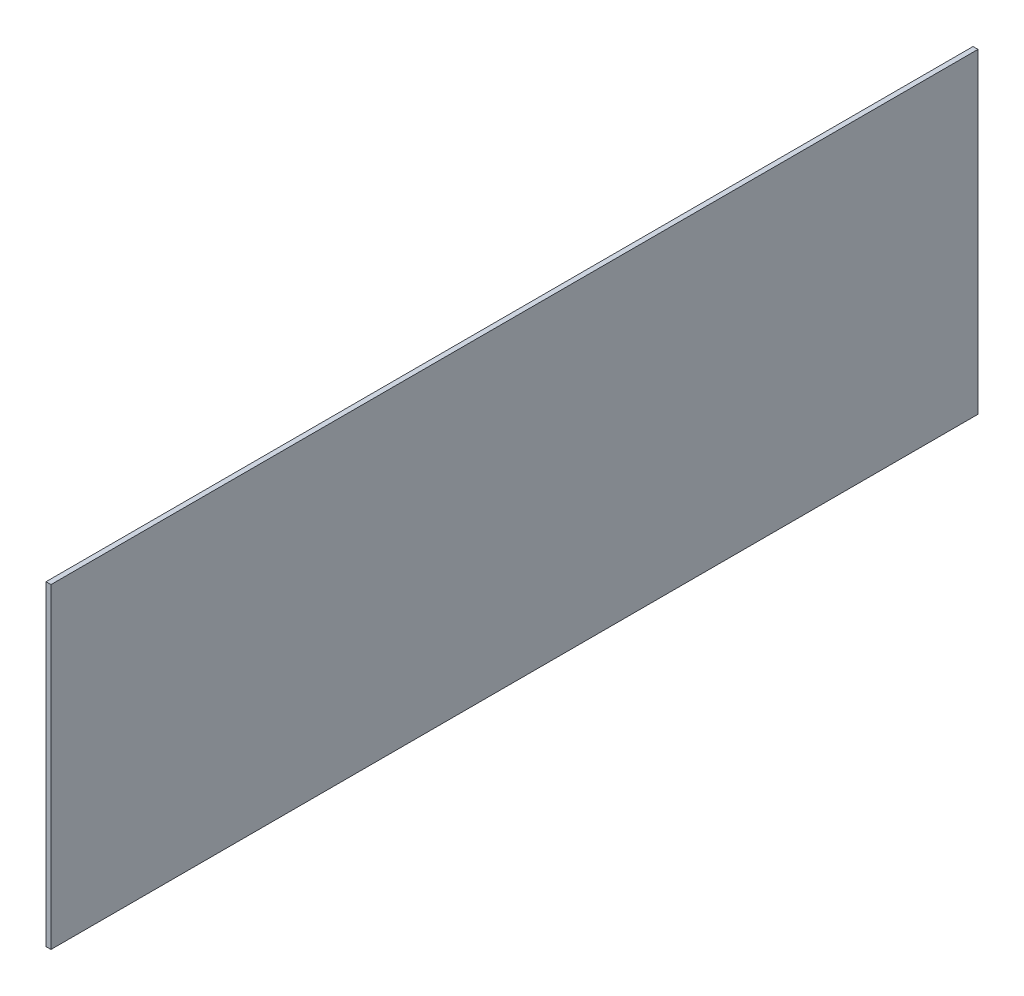
ISO-10303-21;
HEADER;
FILE_DESCRIPTION(('STEP AP214'),'2;1');
FILE_NAME('part.step','',(''),(''),'','','');
FILE_SCHEMA(('AUTOMOTIVE_DESIGN { 1 0 10303 214 1 1 1 1 }'));
ENDSEC;
DATA;
#1=APPLICATION_CONTEXT('core data for automotive mechanical design processes');
#2=APPLICATION_PROTOCOL_DEFINITION('international standard','automotive_design',2000,#1);
#3=PRODUCT_CONTEXT('',#1,'mechanical');
#4=PRODUCT('Part','Part','',(#3));
#5=PRODUCT_RELATED_PRODUCT_CATEGORY('part','',(#4));
#6=PRODUCT_DEFINITION_FORMATION('','',#4);
#7=PRODUCT_DEFINITION_CONTEXT('part definition',#1,'design');
#8=PRODUCT_DEFINITION('design','',#6,#7);
#9=PRODUCT_DEFINITION_SHAPE('','',#8);
#10=(LENGTH_UNIT() NAMED_UNIT(*) SI_UNIT(.MILLI.,.METRE.));
#11=(NAMED_UNIT(*) PLANE_ANGLE_UNIT() SI_UNIT($,.RADIAN.));
#12=(NAMED_UNIT(*) SI_UNIT($,.STERADIAN.) SOLID_ANGLE_UNIT());
#13=UNCERTAINTY_MEASURE_WITH_UNIT(LENGTH_MEASURE(1.E-05),#10,'distance_accuracy_value','');
#14=(GEOMETRIC_REPRESENTATION_CONTEXT(3) GLOBAL_UNCERTAINTY_ASSIGNED_CONTEXT((#13)) GLOBAL_UNIT_ASSIGNED_CONTEXT((#10,
#11,#12)) REPRESENTATION_CONTEXT('',''));
#15=CARTESIAN_POINT('',(0.,0.,0.));
#16=DIRECTION('',(0.,0.,1.));
#17=DIRECTION('',(1.,0.,0.));
#18=AXIS2_PLACEMENT_3D('',#15,#16,#17);
#19=CARTESIAN_POINT('',(-5.,0.,-935.));
#20=DIRECTION('',(0.,1.,0.));
#21=DIRECTION('',(1.,0.,0.));
#22=AXIS2_PLACEMENT_3D('',#19,#20,#21);
#23=PLANE('',#22);
#24=DIRECTION('',(-1.,0.,0.));
#25=VECTOR('',#24,1.);
#26=CARTESIAN_POINT('',(0.,0.,-1870.));
#27=LINE('',#26,#25);
#28=CARTESIAN_POINT('',(0.,0.,-1870.));
#29=VERTEX_POINT('',#28);
#30=CARTESIAN_POINT('',(-10.,0.,-1870.));
#31=VERTEX_POINT('',#30);
#32=EDGE_CURVE('E27',#29,#31,#27,.T.);
#33=ORIENTED_EDGE('',*,*,#32,.F.);
#34=DIRECTION('',(0.,0.,-1.));
#35=VECTOR('',#34,1.);
#36=CARTESIAN_POINT('',(0.,0.,0.));
#37=LINE('',#36,#35);
#38=CARTESIAN_POINT('',(0.,0.,0.));
#39=VERTEX_POINT('',#38);
#40=EDGE_CURVE('E72',#39,#29,#37,.T.);
#41=ORIENTED_EDGE('',*,*,#40,.F.);
#42=DIRECTION('',(1.,0.,0.));
#43=VECTOR('',#42,1.);
#44=CARTESIAN_POINT('',(-10.,0.,0.));
#45=LINE('',#44,#43);
#46=CARTESIAN_POINT('',(-10.,0.,0.));
#47=VERTEX_POINT('',#46);
#48=EDGE_CURVE('E97',#47,#39,#45,.T.);
#49=ORIENTED_EDGE('',*,*,#48,.F.);
#50=DIRECTION('',(0.,0.,1.));
#51=VECTOR('',#50,1.);
#52=CARTESIAN_POINT('',(-10.,0.,-1870.));
#53=LINE('',#52,#51);
#54=EDGE_CURVE('E73',#31,#47,#53,.T.);
#55=ORIENTED_EDGE('',*,*,#54,.F.);
#56=EDGE_LOOP('',(#33,#41,#49,#55));
#57=FACE_BOUND('',#56,.T.);
#58=ADVANCED_FACE('F17',(#57),#23,.F.);
#59=CARTESIAN_POINT('',(-5.,637.5,-935.));
#60=DIRECTION('',(0.,1.,0.));
#61=DIRECTION('',(1.,0.,0.));
#62=AXIS2_PLACEMENT_3D('',#59,#60,#61);
#63=PLANE('',#62);
#64=DIRECTION('',(-1.,0.,0.));
#65=VECTOR('',#64,1.);
#66=CARTESIAN_POINT('',(0.,637.5,-1870.));
#67=LINE('',#66,#65);
#68=CARTESIAN_POINT('',(0.,637.5,-1870.));
#69=VERTEX_POINT('',#68);
#70=CARTESIAN_POINT('',(-10.,637.5,-1870.));
#71=VERTEX_POINT('',#70);
#72=EDGE_CURVE('E11',#69,#71,#67,.T.);
#73=ORIENTED_EDGE('',*,*,#72,.T.);
#74=DIRECTION('',(0.,0.,1.));
#75=VECTOR('',#74,1.);
#76=CARTESIAN_POINT('',(-10.,637.5,-1870.));
#77=LINE('',#76,#75);
#78=CARTESIAN_POINT('',(-10.,637.5,0.));
#79=VERTEX_POINT('',#78);
#80=EDGE_CURVE('E104',#71,#79,#77,.T.);
#81=ORIENTED_EDGE('',*,*,#80,.T.);
#82=DIRECTION('',(1.,0.,0.));
#83=VECTOR('',#82,1.);
#84=CARTESIAN_POINT('',(-10.,637.5,0.));
#85=LINE('',#84,#83);
#86=CARTESIAN_POINT('',(0.,637.5,0.));
#87=VERTEX_POINT('',#86);
#88=EDGE_CURVE('E99',#79,#87,#85,.T.);
#89=ORIENTED_EDGE('',*,*,#88,.T.);
#90=DIRECTION('',(0.,0.,-1.));
#91=VECTOR('',#90,1.);
#92=CARTESIAN_POINT('',(0.,637.5,0.));
#93=LINE('',#92,#91);
#94=EDGE_CURVE('E84',#87,#69,#93,.T.);
#95=ORIENTED_EDGE('',*,*,#94,.T.);
#96=EDGE_LOOP('',(#73,#81,#89,#95));
#97=FACE_BOUND('',#96,.T.);
#98=ADVANCED_FACE('F118',(#97),#63,.T.);
#99=CARTESIAN_POINT('',(0.,0.,-1870.));
#100=DIRECTION('',(0.,0.,-1.));
#101=DIRECTION('',(0.,-1.,0.));
#102=AXIS2_PLACEMENT_3D('',#99,#100,#101);
#103=PLANE('',#102);
#104=ORIENTED_EDGE('',*,*,#32,.T.);
#105=DIRECTION('',(0.,1.,0.));
#106=VECTOR('',#105,1.);
#107=CARTESIAN_POINT('',(-10.,0.,-1870.));
#108=LINE('',#107,#106);
#109=EDGE_CURVE('E76',#31,#71,#108,.T.);
#110=ORIENTED_EDGE('',*,*,#109,.T.);
#111=ORIENTED_EDGE('',*,*,#72,.F.);
#112=DIRECTION('',(0.,1.,0.));
#113=VECTOR('',#112,1.);
#114=CARTESIAN_POINT('',(0.,0.,-1870.));
#115=LINE('',#114,#113);
#116=EDGE_CURVE('E79',#29,#69,#115,.T.);
#117=ORIENTED_EDGE('',*,*,#116,.F.);
#118=EDGE_LOOP('',(#104,#110,#111,#117));
#119=FACE_BOUND('',#118,.T.);
#120=ADVANCED_FACE('F80',(#119),#103,.T.);
#121=CARTESIAN_POINT('',(-10.,0.,-1870.));
#122=DIRECTION('',(-1.,0.,0.));
#123=DIRECTION('',(0.,0.,1.));
#124=AXIS2_PLACEMENT_3D('',#121,#122,#123);
#125=PLANE('',#124);
#126=ORIENTED_EDGE('',*,*,#54,.T.);
#127=DIRECTION('',(0.,1.,0.));
#128=VECTOR('',#127,1.);
#129=CARTESIAN_POINT('',(-10.,0.,0.));
#130=LINE('',#129,#128);
#131=EDGE_CURVE('E20',#47,#79,#130,.T.);
#132=ORIENTED_EDGE('',*,*,#131,.T.);
#133=ORIENTED_EDGE('',*,*,#80,.F.);
#134=ORIENTED_EDGE('',*,*,#109,.F.);
#135=EDGE_LOOP('',(#126,#132,#133,#134));
#136=FACE_BOUND('',#135,.T.);
#137=ADVANCED_FACE('F113',(#136),#125,.T.);
#138=CARTESIAN_POINT('',(-10.,0.,0.));
#139=DIRECTION('',(0.,0.,1.));
#140=DIRECTION('',(1.,0.,0.));
#141=AXIS2_PLACEMENT_3D('',#138,#139,#140);
#142=PLANE('',#141);
#143=ORIENTED_EDGE('',*,*,#48,.T.);
#144=DIRECTION('',(0.,1.,0.));
#145=VECTOR('',#144,1.);
#146=CARTESIAN_POINT('',(0.,0.,0.));
#147=LINE('',#146,#145);
#148=EDGE_CURVE('E89',#39,#87,#147,.T.);
#149=ORIENTED_EDGE('',*,*,#148,.T.);
#150=ORIENTED_EDGE('',*,*,#88,.F.);
#151=ORIENTED_EDGE('',*,*,#131,.F.);
#152=EDGE_LOOP('',(#143,#149,#150,#151));
#153=FACE_BOUND('',#152,.T.);
#154=ADVANCED_FACE('F117',(#153),#142,.T.);
#155=CARTESIAN_POINT('',(0.,0.,0.));
#156=DIRECTION('',(1.,0.,0.));
#157=DIRECTION('',(0.,1.,0.));
#158=AXIS2_PLACEMENT_3D('',#155,#156,#157);
#159=PLANE('',#158);
#160=ORIENTED_EDGE('',*,*,#40,.T.);
#161=ORIENTED_EDGE('',*,*,#116,.T.);
#162=ORIENTED_EDGE('',*,*,#94,.F.);
#163=ORIENTED_EDGE('',*,*,#148,.F.);
#164=EDGE_LOOP('',(#160,#161,#162,#163));
#165=FACE_BOUND('',#164,.T.);
#166=ADVANCED_FACE('F87',(#165),#159,.T.);
#167=CLOSED_SHELL('',(#58,#98,#120,#137,#154,#166));
#168=MANIFOLD_SOLID_BREP('B1',#167);
#169=ADVANCED_BREP_SHAPE_REPRESENTATION('',(#18,#168),#14);
#170=SHAPE_DEFINITION_REPRESENTATION(#9,#169);
ENDSEC;
END-ISO-10303-21;
